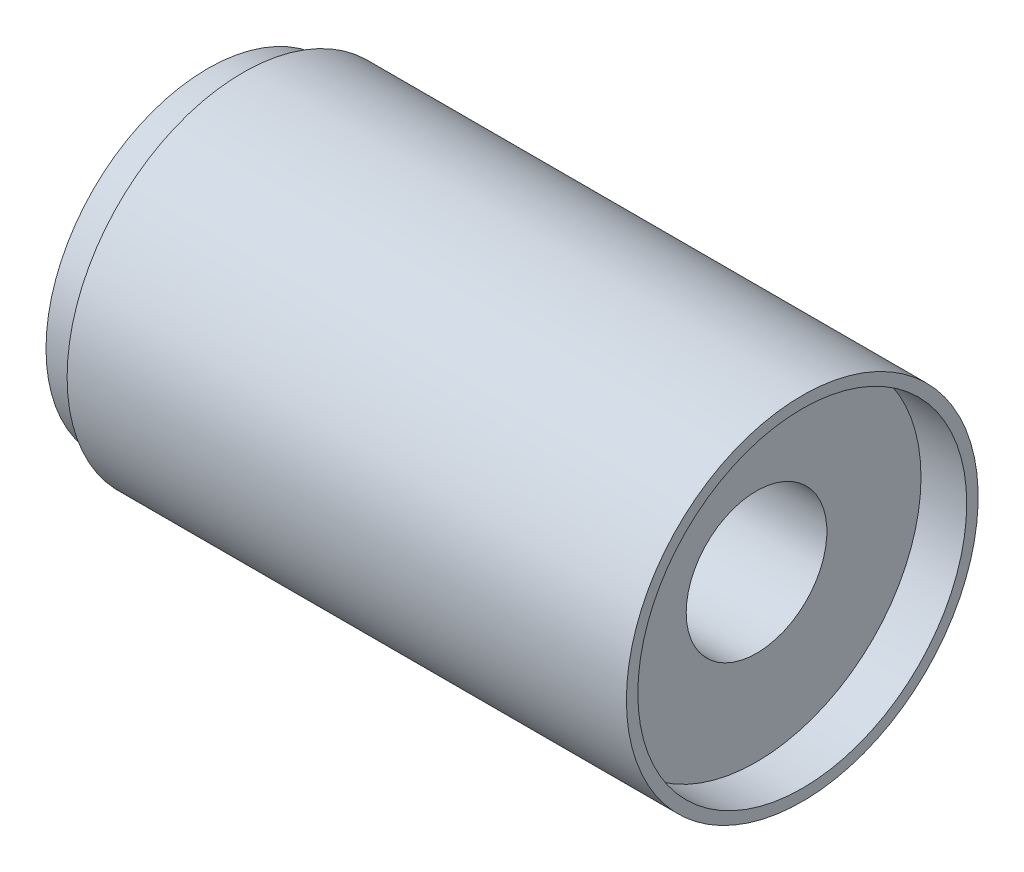
ISO-10303-21;
HEADER;
FILE_DESCRIPTION(('STEP AP214'),'2;1');
FILE_NAME('part.step','',(''),(''),'','','');
FILE_SCHEMA(('AUTOMOTIVE_DESIGN { 1 0 10303 214 1 1 1 1 }'));
ENDSEC;
DATA;
#1=APPLICATION_CONTEXT('core data for automotive mechanical design processes');
#2=APPLICATION_PROTOCOL_DEFINITION('international standard','automotive_design',2000,#1);
#3=PRODUCT_CONTEXT('',#1,'mechanical');
#4=PRODUCT('Part','Part','',(#3));
#5=PRODUCT_RELATED_PRODUCT_CATEGORY('part','',(#4));
#6=PRODUCT_DEFINITION_FORMATION('','',#4);
#7=PRODUCT_DEFINITION_CONTEXT('part definition',#1,'design');
#8=PRODUCT_DEFINITION('design','',#6,#7);
#9=PRODUCT_DEFINITION_SHAPE('','',#8);
#10=(LENGTH_UNIT() NAMED_UNIT(*) SI_UNIT(.MILLI.,.METRE.));
#11=(NAMED_UNIT(*) PLANE_ANGLE_UNIT() SI_UNIT($,.RADIAN.));
#12=(NAMED_UNIT(*) SI_UNIT($,.STERADIAN.) SOLID_ANGLE_UNIT());
#13=UNCERTAINTY_MEASURE_WITH_UNIT(LENGTH_MEASURE(1.E-05),#10,'distance_accuracy_value','');
#14=(GEOMETRIC_REPRESENTATION_CONTEXT(3) GLOBAL_UNCERTAINTY_ASSIGNED_CONTEXT((#13)) GLOBAL_UNIT_ASSIGNED_CONTEXT((#10,
#11,#12)) REPRESENTATION_CONTEXT('',''));
#15=CARTESIAN_POINT('',(0.,0.,0.));
#16=DIRECTION('',(0.,0.,1.));
#17=DIRECTION('',(1.,0.,0.));
#18=AXIS2_PLACEMENT_3D('',#15,#16,#17);
#19=CARTESIAN_POINT('',(8.93,0.,2.25));
#20=DIRECTION('',(-1.,0.,0.));
#21=DIRECTION('',(0.,0.,1.));
#22=AXIS2_PLACEMENT_3D('',#19,#20,#21);
#23=PLANE('',#22);
#24=CARTESIAN_POINT('',(8.93,0.,0.));
#25=DIRECTION('',(1.,0.,0.));
#26=DIRECTION('',(0.,0.,-1.));
#27=AXIS2_PLACEMENT_3D('',#24,#25,#26);
#28=CIRCLE('',#27,2.5);
#29=CARTESIAN_POINT('',(8.93,0.,-2.5));
#30=VERTEX_POINT('',#29);
#31=EDGE_CURVE('E16',#30,#30,#28,.T.);
#32=ORIENTED_EDGE('',*,*,#31,.F.);
#33=EDGE_LOOP('',(#32));
#34=FACE_BOUND('',#33,.T.);
#35=CARTESIAN_POINT('',(8.93,0.,0.));
#36=DIRECTION('',(-1.,0.,0.));
#37=DIRECTION('',(0.,0.,1.));
#38=AXIS2_PLACEMENT_3D('',#35,#36,#37);
#39=CIRCLE('',#38,2.);
#40=CARTESIAN_POINT('',(8.93,0.,2.));
#41=VERTEX_POINT('',#40);
#42=EDGE_CURVE('E44',#41,#41,#39,.F.);
#43=ORIENTED_EDGE('',*,*,#42,.T.);
#44=EDGE_LOOP('',(#43));
#45=FACE_BOUND('',#44,.T.);
#46=ADVANCED_FACE('F13',(#34,#45),#23,.T.);
#47=CARTESIAN_POINT('',(9.23,0.,0.));
#48=DIRECTION('',(1.,0.,0.));
#49=DIRECTION('',(0.,0.,-1.));
#50=AXIS2_PLACEMENT_3D('',#47,#48,#49);
#51=CYLINDRICAL_SURFACE('',#50,2.5);
#52=CARTESIAN_POINT('',(9.53,0.,0.));
#53=DIRECTION('',(1.,0.,0.));
#54=DIRECTION('',(0.,0.,-1.));
#55=AXIS2_PLACEMENT_3D('',#52,#53,#54);
#56=CIRCLE('',#55,2.5);
#57=CARTESIAN_POINT('',(9.53,0.,-2.5));
#58=VERTEX_POINT('',#57);
#59=EDGE_CURVE('E42',#58,#58,#56,.T.);
#60=ORIENTED_EDGE('',*,*,#59,.F.);
#61=EDGE_LOOP('',(#60));
#62=FACE_BOUND('',#61,.T.);
#63=ORIENTED_EDGE('',*,*,#31,.T.);
#64=EDGE_LOOP('',(#63));
#65=FACE_BOUND('',#64,.T.);
#66=ADVANCED_FACE('F51',(#62,#65),#51,.T.);
#67=CARTESIAN_POINT('',(17.98,0.,0.));
#68=DIRECTION('',(-1.,0.,0.));
#69=DIRECTION('',(0.,0.,1.));
#70=AXIS2_PLACEMENT_3D('',#67,#68,#69);
#71=CYLINDRICAL_SURFACE('',#70,2.);
#72=ORIENTED_EDGE('',*,*,#42,.F.);
#73=EDGE_LOOP('',(#72));
#74=FACE_BOUND('',#73,.T.);
#75=CARTESIAN_POINT('',(25.13,0.,0.));
#76=DIRECTION('',(-1.,0.,0.));
#77=DIRECTION('',(0.,0.,1.));
#78=AXIS2_PLACEMENT_3D('',#75,#76,#77);
#79=CIRCLE('',#78,2.);
#80=CARTESIAN_POINT('',(25.13,0.,2.));
#81=VERTEX_POINT('',#80);
#82=EDGE_CURVE('E39',#81,#81,#79,.F.);
#83=ORIENTED_EDGE('',*,*,#82,.T.);
#84=EDGE_LOOP('',(#83));
#85=FACE_BOUND('',#84,.T.);
#86=ADVANCED_FACE('F58',(#74,#85),#71,.F.);
#87=CARTESIAN_POINT('',(9.53,0.,3.3));
#88=DIRECTION('',(-1.,0.,0.));
#89=DIRECTION('',(0.,0.,1.));
#90=AXIS2_PLACEMENT_3D('',#87,#88,#89);
#91=PLANE('',#90);
#92=CARTESIAN_POINT('',(9.53,0.,0.));
#93=DIRECTION('',(-1.,0.,0.));
#94=DIRECTION('',(0.,0.,1.));
#95=AXIS2_PLACEMENT_3D('',#92,#93,#94);
#96=CIRCLE('',#95,4.6);
#97=CARTESIAN_POINT('',(9.53,0.,4.6));
#98=VERTEX_POINT('',#97);
#99=EDGE_CURVE('E36',#98,#98,#96,.F.);
#100=ORIENTED_EDGE('',*,*,#99,.F.);
#101=EDGE_LOOP('',(#100));
#102=FACE_BOUND('',#101,.T.);
#103=ORIENTED_EDGE('',*,*,#59,.T.);
#104=EDGE_LOOP('',(#103));
#105=FACE_BOUND('',#104,.T.);
#106=ADVANCED_FACE('F86',(#102,#105),#91,.T.);
#107=CARTESIAN_POINT('',(25.13,0.,0.));
#108=DIRECTION('',(-1.,0.,0.));
#109=DIRECTION('',(0.,0.,1.));
#110=AXIS2_PLACEMENT_3D('',#107,#108,#109);
#111=PLANE('',#110);
#112=CARTESIAN_POINT('',(25.13,0.,0.));
#113=DIRECTION('',(1.,0.,0.));
#114=DIRECTION('',(0.,0.,-1.));
#115=AXIS2_PLACEMENT_3D('',#112,#113,#114);
#116=CIRCLE('',#115,4.675);
#117=CARTESIAN_POINT('',(25.13,0.,-4.675));
#118=VERTEX_POINT('',#117);
#119=EDGE_CURVE('E33',#118,#118,#116,.T.);
#120=ORIENTED_EDGE('',*,*,#119,.T.);
#121=EDGE_LOOP('',(#120));
#122=FACE_BOUND('',#121,.T.);
#123=ORIENTED_EDGE('',*,*,#82,.F.);
#124=EDGE_LOOP('',(#123));
#125=FACE_BOUND('',#124,.T.);
#126=ADVANCED_FACE('F82',(#122,#125),#111,.F.);
#127=CARTESIAN_POINT('',(10.03,0.,0.));
#128=DIRECTION('',(-1.,0.,0.));
#129=DIRECTION('',(0.,0.,1.));
#130=AXIS2_PLACEMENT_3D('',#127,#128,#129);
#131=CYLINDRICAL_SURFACE('',#130,4.6);
#132=CARTESIAN_POINT('',(10.53,0.,0.));
#133=DIRECTION('',(-1.,0.,0.));
#134=DIRECTION('',(0.,0.,1.));
#135=AXIS2_PLACEMENT_3D('',#132,#133,#134);
#136=CIRCLE('',#135,4.6);
#137=CARTESIAN_POINT('',(10.53,0.,4.6));
#138=VERTEX_POINT('',#137);
#139=EDGE_CURVE('E30',#138,#138,#136,.F.);
#140=ORIENTED_EDGE('',*,*,#139,.F.);
#141=EDGE_LOOP('',(#140));
#142=FACE_BOUND('',#141,.T.);
#143=ORIENTED_EDGE('',*,*,#99,.T.);
#144=EDGE_LOOP('',(#143));
#145=FACE_BOUND('',#144,.T.);
#146=ADVANCED_FACE('F78',(#142,#145),#131,.T.);
#147=CARTESIAN_POINT('',(25.78,0.,0.));
#148=DIRECTION('',(1.,0.,0.));
#149=DIRECTION('',(0.,0.,-1.));
#150=AXIS2_PLACEMENT_3D('',#147,#148,#149);
#151=CYLINDRICAL_SURFACE('',#150,4.675);
#152=CARTESIAN_POINT('',(26.43,0.,0.));
#153=DIRECTION('',(1.,0.,0.));
#154=DIRECTION('',(0.,0.,-1.));
#155=AXIS2_PLACEMENT_3D('',#152,#153,#154);
#156=CIRCLE('',#155,4.675);
#157=CARTESIAN_POINT('',(26.43,0.,-4.675));
#158=VERTEX_POINT('',#157);
#159=EDGE_CURVE('E25',#158,#158,#156,.F.);
#160=ORIENTED_EDGE('',*,*,#159,.F.);
#161=EDGE_LOOP('',(#160));
#162=FACE_BOUND('',#161,.T.);
#163=ORIENTED_EDGE('',*,*,#119,.F.);
#164=EDGE_LOOP('',(#163));
#165=FACE_BOUND('',#164,.T.);
#166=ADVANCED_FACE('F74',(#162,#165),#151,.F.);
#167=CARTESIAN_POINT('',(10.53,0.,4.8));
#168=DIRECTION('',(-1.,0.,0.));
#169=DIRECTION('',(0.,0.,1.));
#170=AXIS2_PLACEMENT_3D('',#167,#168,#169);
#171=PLANE('',#170);
#172=ORIENTED_EDGE('',*,*,#139,.T.);
#173=EDGE_LOOP('',(#172));
#174=FACE_BOUND('',#173,.T.);
#175=CARTESIAN_POINT('',(10.53,0.,0.));
#176=DIRECTION('',(-1.,0.,0.));
#177=DIRECTION('',(0.,0.,1.));
#178=AXIS2_PLACEMENT_3D('',#175,#176,#177);
#179=CIRCLE('',#178,5.);
#180=CARTESIAN_POINT('',(10.53,0.,5.));
#181=VERTEX_POINT('',#180);
#182=EDGE_CURVE('E20',#181,#181,#179,.F.);
#183=ORIENTED_EDGE('',*,*,#182,.F.);
#184=EDGE_LOOP('',(#183));
#185=FACE_BOUND('',#184,.T.);
#186=ADVANCED_FACE('F68',(#174,#185),#171,.T.);
#187=CARTESIAN_POINT('',(26.43,0.,3.5));
#188=DIRECTION('',(1.,0.,0.));
#189=DIRECTION('',(0.,0.,-1.));
#190=AXIS2_PLACEMENT_3D('',#187,#188,#189);
#191=PLANE('',#190);
#192=CARTESIAN_POINT('',(26.43,0.,0.));
#193=DIRECTION('',(-1.,0.,0.));
#194=DIRECTION('',(0.,0.,1.));
#195=AXIS2_PLACEMENT_3D('',#192,#193,#194);
#196=CIRCLE('',#195,5.);
#197=CARTESIAN_POINT('',(26.43,0.,5.));
#198=VERTEX_POINT('',#197);
#199=EDGE_CURVE('E9',#198,#198,#196,.T.);
#200=ORIENTED_EDGE('',*,*,#199,.F.);
#201=EDGE_LOOP('',(#200));
#202=FACE_BOUND('',#201,.T.);
#203=ORIENTED_EDGE('',*,*,#159,.T.);
#204=EDGE_LOOP('',(#203));
#205=FACE_BOUND('',#204,.T.);
#206=ADVANCED_FACE('F62',(#202,#205),#191,.T.);
#207=CARTESIAN_POINT('',(18.48,0.,0.));
#208=DIRECTION('',(-1.,0.,0.));
#209=DIRECTION('',(0.,0.,1.));
#210=AXIS2_PLACEMENT_3D('',#207,#208,#209);
#211=CYLINDRICAL_SURFACE('',#210,5.);
#212=ORIENTED_EDGE('',*,*,#182,.T.);
#213=EDGE_LOOP('',(#212));
#214=FACE_BOUND('',#213,.T.);
#215=ORIENTED_EDGE('',*,*,#199,.T.);
#216=EDGE_LOOP('',(#215));
#217=FACE_BOUND('',#216,.T.);
#218=ADVANCED_FACE('F60',(#214,#217),#211,.T.);
#219=CLOSED_SHELL('',(#46,#66,#86,#106,#126,#146,#166,#186,#206,#218));
#220=MANIFOLD_SOLID_BREP('B1',#219);
#221=ADVANCED_BREP_SHAPE_REPRESENTATION('',(#18,#220),#14);
#222=SHAPE_DEFINITION_REPRESENTATION(#9,#221);
ENDSEC;
END-ISO-10303-21;
